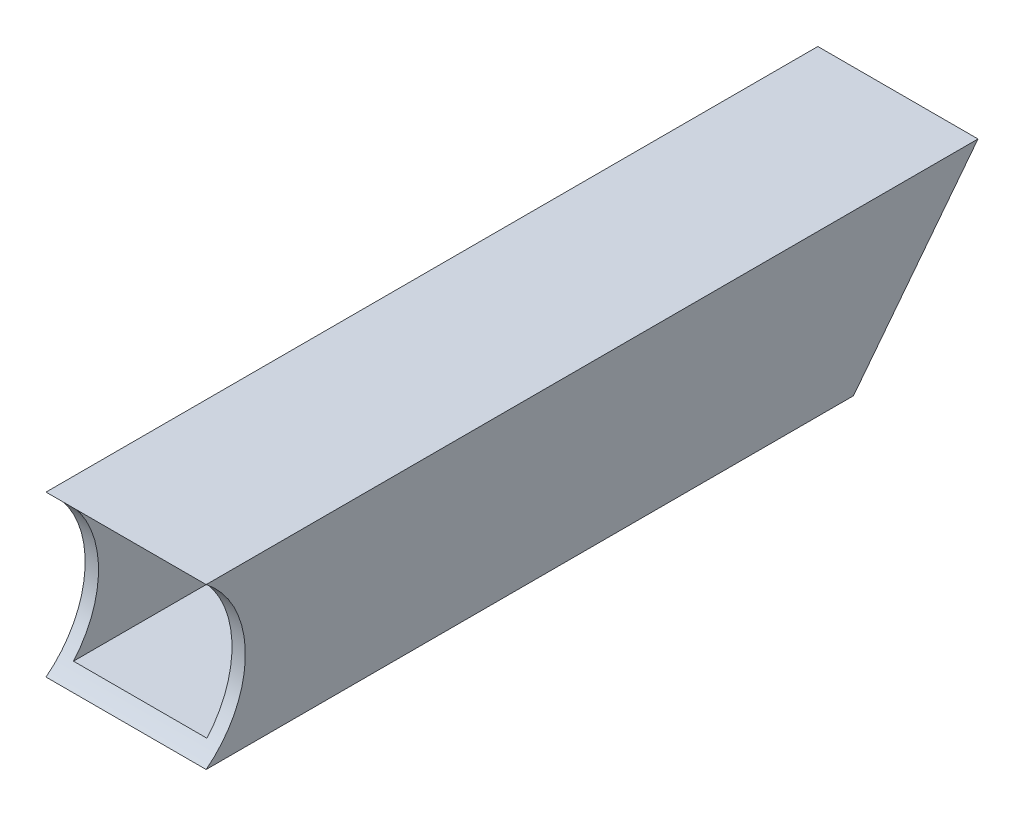
ISO-10303-21;
HEADER;
FILE_DESCRIPTION(('STEP AP214'),'2;1');
FILE_NAME('part.step','',(''),(''),'','','');
FILE_SCHEMA(('AUTOMOTIVE_DESIGN { 1 0 10303 214 1 1 1 1 }'));
ENDSEC;
DATA;
#1=APPLICATION_CONTEXT('core data for automotive mechanical design processes');
#2=APPLICATION_PROTOCOL_DEFINITION('international standard','automotive_design',2000,#1);
#3=PRODUCT_CONTEXT('',#1,'mechanical');
#4=PRODUCT('Part','Part','',(#3));
#5=PRODUCT_RELATED_PRODUCT_CATEGORY('part','',(#4));
#6=PRODUCT_DEFINITION_FORMATION('','',#4);
#7=PRODUCT_DEFINITION_CONTEXT('part definition',#1,'design');
#8=PRODUCT_DEFINITION('design','',#6,#7);
#9=PRODUCT_DEFINITION_SHAPE('','',#8);
#10=(LENGTH_UNIT() NAMED_UNIT(*) SI_UNIT(.MILLI.,.METRE.));
#11=(NAMED_UNIT(*) PLANE_ANGLE_UNIT() SI_UNIT($,.RADIAN.));
#12=(NAMED_UNIT(*) SI_UNIT($,.STERADIAN.) SOLID_ANGLE_UNIT());
#13=UNCERTAINTY_MEASURE_WITH_UNIT(LENGTH_MEASURE(1.E-05),#10,'distance_accuracy_value','');
#14=(GEOMETRIC_REPRESENTATION_CONTEXT(3) GLOBAL_UNCERTAINTY_ASSIGNED_CONTEXT((#13)) GLOBAL_UNIT_ASSIGNED_CONTEXT((#10,
#11,#12)) REPRESENTATION_CONTEXT('',''));
#15=CARTESIAN_POINT('',(0.,0.,0.));
#16=DIRECTION('',(0.,0.,1.));
#17=DIRECTION('',(1.,0.,0.));
#18=AXIS2_PLACEMENT_3D('',#15,#16,#17);
#19=CARTESIAN_POINT('',(38.1,19.05,0.));
#20=DIRECTION('',(-1.,0.,0.));
#21=DIRECTION('',(0.,0.,1.));
#22=AXIS2_PLACEMENT_3D('',#19,#20,#21);
#23=CYLINDRICAL_SURFACE('',#22,24.13);
#24=DIRECTION('',(-1.,0.,0.));
#25=VECTOR('',#24,1.);
#26=CARTESIAN_POINT('',(38.1,34.925,-18.1725417869928));
#27=LINE('',#26,#25);
#28=CARTESIAN_POINT('',(34.925,34.925,-18.1725417869928));
#29=VERTEX_POINT('',#28);
#30=CARTESIAN_POINT('',(3.175,34.925,-18.1725417869928));
#31=VERTEX_POINT('',#30);
#32=EDGE_CURVE('E110',#29,#31,#27,.T.);
#33=ORIENTED_EDGE('',*,*,#32,.F.);
#34=CARTESIAN_POINT('',(34.925,19.05,0.));
#35=DIRECTION('',(1.,0.,0.));
#36=DIRECTION('',(0.,0.,-1.));
#37=AXIS2_PLACEMENT_3D('',#34,#35,#36);
#38=CIRCLE('',#37,24.13);
#39=CARTESIAN_POINT('',(34.925,3.175,-18.1725417869928));
#40=VERTEX_POINT('',#39);
#41=EDGE_CURVE('E152',#40,#29,#38,.T.);
#42=ORIENTED_EDGE('',*,*,#41,.F.);
#43=DIRECTION('',(-1.,0.,0.));
#44=VECTOR('',#43,1.);
#45=CARTESIAN_POINT('',(38.1,3.175,-18.1725417869928));
#46=LINE('',#45,#44);
#47=CARTESIAN_POINT('',(3.175,3.175,-18.1725417869928));
#48=VERTEX_POINT('',#47);
#49=EDGE_CURVE('E154',#48,#40,#46,.F.);
#50=ORIENTED_EDGE('',*,*,#49,.F.);
#51=CARTESIAN_POINT('',(3.175,19.05,0.));
#52=DIRECTION('',(-1.,0.,0.));
#53=DIRECTION('',(0.,0.,1.));
#54=AXIS2_PLACEMENT_3D('',#51,#52,#53);
#55=CIRCLE('',#54,24.13);
#56=EDGE_CURVE('E156',#31,#48,#55,.T.);
#57=ORIENTED_EDGE('',*,*,#56,.F.);
#58=EDGE_LOOP('',(#33,#42,#50,#57));
#59=FACE_BOUND('',#58,.T.);
#60=CARTESIAN_POINT('',(0.,19.05,0.));
#61=DIRECTION('',(1.,0.,0.));
#62=DIRECTION('',(0.,0.,-1.));
#63=AXIS2_PLACEMENT_3D('',#60,#61,#62);
#64=CIRCLE('',#63,24.13);
#65=CARTESIAN_POINT('',(0.,0.,-14.8106178129071));
#66=VERTEX_POINT('',#65);
#67=CARTESIAN_POINT('',(0.,38.1,-14.8106178129071));
#68=VERTEX_POINT('',#67);
#69=EDGE_CURVE('E139',#66,#68,#64,.T.);
#70=ORIENTED_EDGE('',*,*,#69,.F.);
#71=DIRECTION('',(-1.,0.,0.));
#72=VECTOR('',#71,1.);
#73=CARTESIAN_POINT('',(38.1,0.,-14.8106178129071));
#74=LINE('',#73,#72);
#75=CARTESIAN_POINT('',(38.1,0.,-14.8106178129071));
#76=VERTEX_POINT('',#75);
#77=EDGE_CURVE('E103',#76,#66,#74,.T.);
#78=ORIENTED_EDGE('',*,*,#77,.F.);
#79=CARTESIAN_POINT('',(38.1,19.05,0.));
#80=DIRECTION('',(1.,0.,0.));
#81=DIRECTION('',(0.,0.,-1.));
#82=AXIS2_PLACEMENT_3D('',#79,#80,#81);
#83=CIRCLE('',#82,24.13);
#84=CARTESIAN_POINT('',(38.1,38.1,-14.8106178129071));
#85=VERTEX_POINT('',#84);
#86=EDGE_CURVE('E132',#76,#85,#83,.T.);
#87=ORIENTED_EDGE('',*,*,#86,.T.);
#88=DIRECTION('',(-1.,0.,0.));
#89=VECTOR('',#88,1.);
#90=CARTESIAN_POINT('',(38.1,38.1,-14.8106178129071));
#91=LINE('',#90,#89);
#92=EDGE_CURVE('E126',#85,#68,#91,.T.);
#93=ORIENTED_EDGE('',*,*,#92,.T.);
#94=EDGE_LOOP('',(#70,#78,#87,#93));
#95=FACE_BOUND('',#94,.T.);
#96=ADVANCED_FACE('F37',(#59,#95),#23,.F.);
#97=CARTESIAN_POINT('',(38.1,0.,0.));
#98=DIRECTION('',(0.,1.,0.));
#99=DIRECTION('',(0.,0.,1.));
#100=AXIS2_PLACEMENT_3D('',#97,#98,#99);
#101=PLANE('',#100);
#102=DIRECTION('',(0.,0.,-1.));
#103=VECTOR('',#102,1.);
#104=CARTESIAN_POINT('',(0.,0.,0.));
#105=LINE('',#104,#103);
#106=CARTESIAN_POINT('',(0.,0.,-168.785784374186));
#107=VERTEX_POINT('',#106);
#108=EDGE_CURVE('E136',#66,#107,#105,.T.);
#109=ORIENTED_EDGE('',*,*,#108,.T.);
#110=DIRECTION('',(-1.,0.,0.));
#111=VECTOR('',#110,1.);
#112=CARTESIAN_POINT('',(38.1,0.,-168.785784374186));
#113=LINE('',#112,#111);
#114=CARTESIAN_POINT('',(38.1,0.,-168.785784374186));
#115=VERTEX_POINT('',#114);
#116=EDGE_CURVE('E122',#115,#107,#113,.T.);
#117=ORIENTED_EDGE('',*,*,#116,.F.);
#118=DIRECTION('',(0.,0.,-1.));
#119=VECTOR('',#118,1.);
#120=CARTESIAN_POINT('',(38.1,0.,0.));
#121=LINE('',#120,#119);
#122=EDGE_CURVE('E147',#76,#115,#121,.T.);
#123=ORIENTED_EDGE('',*,*,#122,.F.);
#124=ORIENTED_EDGE('',*,*,#77,.T.);
#125=EDGE_LOOP('',(#109,#117,#123,#124));
#126=FACE_BOUND('',#125,.T.);
#127=ADVANCED_FACE('F179',(#126),#101,.F.);
#128=CARTESIAN_POINT('',(38.1,-81.7879603229592,-105.198896078094));
#129=DIRECTION('',(0.,-0.613784409983716,-0.789473684210526));
#130=DIRECTION('',(0.,0.789473684210526,-0.613784409983716));
#131=AXIS2_PLACEMENT_3D('',#128,#129,#130);
#132=PLANE('',#131);
#133=DIRECTION('',(1.,0.,0.));
#134=VECTOR('',#133,1.);
#135=CARTESIAN_POINT('',(38.1,34.925,-195.938583697849));
#136=LINE('',#135,#134);
#137=CARTESIAN_POINT('',(3.175,34.925,-195.938583697849));
#138=VERTEX_POINT('',#137);
#139=CARTESIAN_POINT('',(34.925,34.925,-195.938583697849));
#140=VERTEX_POINT('',#139);
#141=EDGE_CURVE('E11',#138,#140,#136,.T.);
#142=ORIENTED_EDGE('',*,*,#141,.F.);
#143=DIRECTION('',(0.,0.789473684210526,-0.613784409983716));
#144=VECTOR('',#143,1.);
#145=CARTESIAN_POINT('',(3.175,-81.7879603229592,-105.198896078094));
#146=LINE('',#145,#144);
#147=CARTESIAN_POINT('',(3.175,3.175,-171.254220676337));
#148=VERTEX_POINT('',#147);
#149=EDGE_CURVE('E97',#148,#138,#146,.T.);
#150=ORIENTED_EDGE('',*,*,#149,.F.);
#151=DIRECTION('',(-1.,0.,0.));
#152=VECTOR('',#151,1.);
#153=CARTESIAN_POINT('',(38.1,3.175,-171.254220676337));
#154=LINE('',#153,#152);
#155=CARTESIAN_POINT('',(34.925,3.175,-171.254220676337));
#156=VERTEX_POINT('',#155);
#157=EDGE_CURVE('E102',#156,#148,#154,.T.);
#158=ORIENTED_EDGE('',*,*,#157,.F.);
#159=DIRECTION('',(0.,-0.789473684210526,0.613784409983716));
#160=VECTOR('',#159,1.);
#161=CARTESIAN_POINT('',(34.925,-81.7879603229592,-105.198896078094));
#162=LINE('',#161,#160);
#163=EDGE_CURVE('E44',#140,#156,#162,.T.);
#164=ORIENTED_EDGE('',*,*,#163,.F.);
#165=EDGE_LOOP('',(#142,#150,#158,#164));
#166=FACE_BOUND('',#165,.T.);
#167=DIRECTION('',(0.,-0.789473684210526,0.613784409983716));
#168=VECTOR('',#167,1.);
#169=CARTESIAN_POINT('',(0.,-81.7879603229592,-105.198896078094));
#170=LINE('',#169,#168);
#171=CARTESIAN_POINT('',(0.,38.1,-198.40702));
#172=VERTEX_POINT('',#171);
#173=EDGE_CURVE('E133',#172,#107,#170,.T.);
#174=ORIENTED_EDGE('',*,*,#173,.F.);
#175=DIRECTION('',(-1.,0.,0.));
#176=VECTOR('',#175,1.);
#177=CARTESIAN_POINT('',(38.1,38.1,-198.40702));
#178=LINE('',#177,#176);
#179=CARTESIAN_POINT('',(38.1,38.1,-198.40702));
#180=VERTEX_POINT('',#179);
#181=EDGE_CURVE('E124',#180,#172,#178,.T.);
#182=ORIENTED_EDGE('',*,*,#181,.F.);
#183=DIRECTION('',(0.,-0.789473684210526,0.613784409983716));
#184=VECTOR('',#183,1.);
#185=CARTESIAN_POINT('',(38.1,-81.7879603229592,-105.198896078094));
#186=LINE('',#185,#184);
#187=EDGE_CURVE('E144',#180,#115,#186,.T.);
#188=ORIENTED_EDGE('',*,*,#187,.T.);
#189=ORIENTED_EDGE('',*,*,#116,.T.);
#190=EDGE_LOOP('',(#174,#182,#188,#189));
#191=FACE_BOUND('',#190,.T.);
#192=ADVANCED_FACE('F114',(#166,#191),#132,.T.);
#193=CARTESIAN_POINT('',(38.1,38.1,0.));
#194=DIRECTION('',(0.,1.,0.));
#195=DIRECTION('',(0.,0.,1.));
#196=AXIS2_PLACEMENT_3D('',#193,#194,#195);
#197=PLANE('',#196);
#198=DIRECTION('',(0.,0.,-1.));
#199=VECTOR('',#198,1.);
#200=CARTESIAN_POINT('',(0.,38.1,0.));
#201=LINE('',#200,#199);
#202=EDGE_CURVE('E129',#68,#172,#201,.T.);
#203=ORIENTED_EDGE('',*,*,#202,.F.);
#204=ORIENTED_EDGE('',*,*,#92,.F.);
#205=DIRECTION('',(0.,0.,-1.));
#206=VECTOR('',#205,1.);
#207=CARTESIAN_POINT('',(38.1,38.1,0.));
#208=LINE('',#207,#206);
#209=EDGE_CURVE('E128',#85,#180,#208,.T.);
#210=ORIENTED_EDGE('',*,*,#209,.T.);
#211=ORIENTED_EDGE('',*,*,#181,.T.);
#212=EDGE_LOOP('',(#203,#204,#210,#211));
#213=FACE_BOUND('',#212,.T.);
#214=ADVANCED_FACE('F187',(#213),#197,.T.);
#215=CARTESIAN_POINT('',(38.1,0.,0.));
#216=DIRECTION('',(1.,0.,0.));
#217=DIRECTION('',(0.,0.,-1.));
#218=AXIS2_PLACEMENT_3D('',#215,#216,#217);
#219=PLANE('',#218);
#220=ORIENTED_EDGE('',*,*,#86,.F.);
#221=ORIENTED_EDGE('',*,*,#122,.T.);
#222=ORIENTED_EDGE('',*,*,#187,.F.);
#223=ORIENTED_EDGE('',*,*,#209,.F.);
#224=EDGE_LOOP('',(#220,#221,#222,#223));
#225=FACE_BOUND('',#224,.T.);
#226=ADVANCED_FACE('F192',(#225),#219,.T.);
#227=CARTESIAN_POINT('',(0.,0.,0.));
#228=DIRECTION('',(1.,0.,0.));
#229=DIRECTION('',(0.,0.,-1.));
#230=AXIS2_PLACEMENT_3D('',#227,#228,#229);
#231=PLANE('',#230);
#232=ORIENTED_EDGE('',*,*,#69,.T.);
#233=ORIENTED_EDGE('',*,*,#202,.T.);
#234=ORIENTED_EDGE('',*,*,#173,.T.);
#235=ORIENTED_EDGE('',*,*,#108,.F.);
#236=EDGE_LOOP('',(#232,#233,#234,#235));
#237=FACE_BOUND('',#236,.T.);
#238=ADVANCED_FACE('F176',(#237),#231,.F.);
#239=CARTESIAN_POINT('',(34.925,34.925,-198.40702));
#240=DIRECTION('',(0.,1.,0.));
#241=DIRECTION('',(0.,0.,1.));
#242=AXIS2_PLACEMENT_3D('',#239,#240,#241);
#243=PLANE('',#242);
#244=ORIENTED_EDGE('',*,*,#32,.T.);
#245=DIRECTION('',(0.,0.,1.));
#246=VECTOR('',#245,1.);
#247=CARTESIAN_POINT('',(3.175,34.925,-198.40702));
#248=LINE('',#247,#246);
#249=EDGE_CURVE('E51',#138,#31,#248,.T.);
#250=ORIENTED_EDGE('',*,*,#249,.F.);
#251=ORIENTED_EDGE('',*,*,#141,.T.);
#252=DIRECTION('',(0.,0.,1.));
#253=VECTOR('',#252,1.);
#254=CARTESIAN_POINT('',(34.925,34.925,-198.40702));
#255=LINE('',#254,#253);
#256=EDGE_CURVE('E157',#140,#29,#255,.T.);
#257=ORIENTED_EDGE('',*,*,#256,.T.);
#258=EDGE_LOOP('',(#244,#250,#251,#257));
#259=FACE_BOUND('',#258,.T.);
#260=ADVANCED_FACE('F106',(#259),#243,.F.);
#261=CARTESIAN_POINT('',(34.925,3.175,-198.40702));
#262=DIRECTION('',(1.,0.,0.));
#263=DIRECTION('',(0.,0.,-1.));
#264=AXIS2_PLACEMENT_3D('',#261,#262,#263);
#265=PLANE('',#264);
#266=ORIENTED_EDGE('',*,*,#41,.T.);
#267=ORIENTED_EDGE('',*,*,#256,.F.);
#268=ORIENTED_EDGE('',*,*,#163,.T.);
#269=DIRECTION('',(0.,0.,1.));
#270=VECTOR('',#269,1.);
#271=CARTESIAN_POINT('',(34.925,3.175,-198.40702));
#272=LINE('',#271,#270);
#273=EDGE_CURVE('E160',#156,#40,#272,.T.);
#274=ORIENTED_EDGE('',*,*,#273,.T.);
#275=EDGE_LOOP('',(#266,#267,#268,#274));
#276=FACE_BOUND('',#275,.T.);
#277=ADVANCED_FACE('F168',(#276),#265,.F.);
#278=CARTESIAN_POINT('',(3.175,3.175,-198.40702));
#279=DIRECTION('',(0.,-1.,0.));
#280=DIRECTION('',(0.,0.,-1.));
#281=AXIS2_PLACEMENT_3D('',#278,#279,#280);
#282=PLANE('',#281);
#283=ORIENTED_EDGE('',*,*,#49,.T.);
#284=ORIENTED_EDGE('',*,*,#273,.F.);
#285=ORIENTED_EDGE('',*,*,#157,.T.);
#286=DIRECTION('',(0.,0.,1.));
#287=VECTOR('',#286,1.);
#288=CARTESIAN_POINT('',(3.175,3.175,-198.40702));
#289=LINE('',#288,#287);
#290=EDGE_CURVE('E56',#148,#48,#289,.T.);
#291=ORIENTED_EDGE('',*,*,#290,.T.);
#292=EDGE_LOOP('',(#283,#284,#285,#291));
#293=FACE_BOUND('',#292,.T.);
#294=ADVANCED_FACE('F167',(#293),#282,.F.);
#295=CARTESIAN_POINT('',(3.175,34.925,-198.40702));
#296=DIRECTION('',(-1.,0.,0.));
#297=DIRECTION('',(0.,0.,1.));
#298=AXIS2_PLACEMENT_3D('',#295,#296,#297);
#299=PLANE('',#298);
#300=ORIENTED_EDGE('',*,*,#56,.T.);
#301=ORIENTED_EDGE('',*,*,#290,.F.);
#302=ORIENTED_EDGE('',*,*,#149,.T.);
#303=ORIENTED_EDGE('',*,*,#249,.T.);
#304=EDGE_LOOP('',(#300,#301,#302,#303));
#305=FACE_BOUND('',#304,.T.);
#306=ADVANCED_FACE('F98',(#305),#299,.F.);
#307=CLOSED_SHELL('',(#96,#127,#192,#214,#226,#238,#260,#277,#294,#306));
#308=MANIFOLD_SOLID_BREP('B2',#307);
#309=ADVANCED_BREP_SHAPE_REPRESENTATION('',(#18,#308),#14);
#310=SHAPE_DEFINITION_REPRESENTATION(#9,#309);
ENDSEC;
END-ISO-10303-21;
